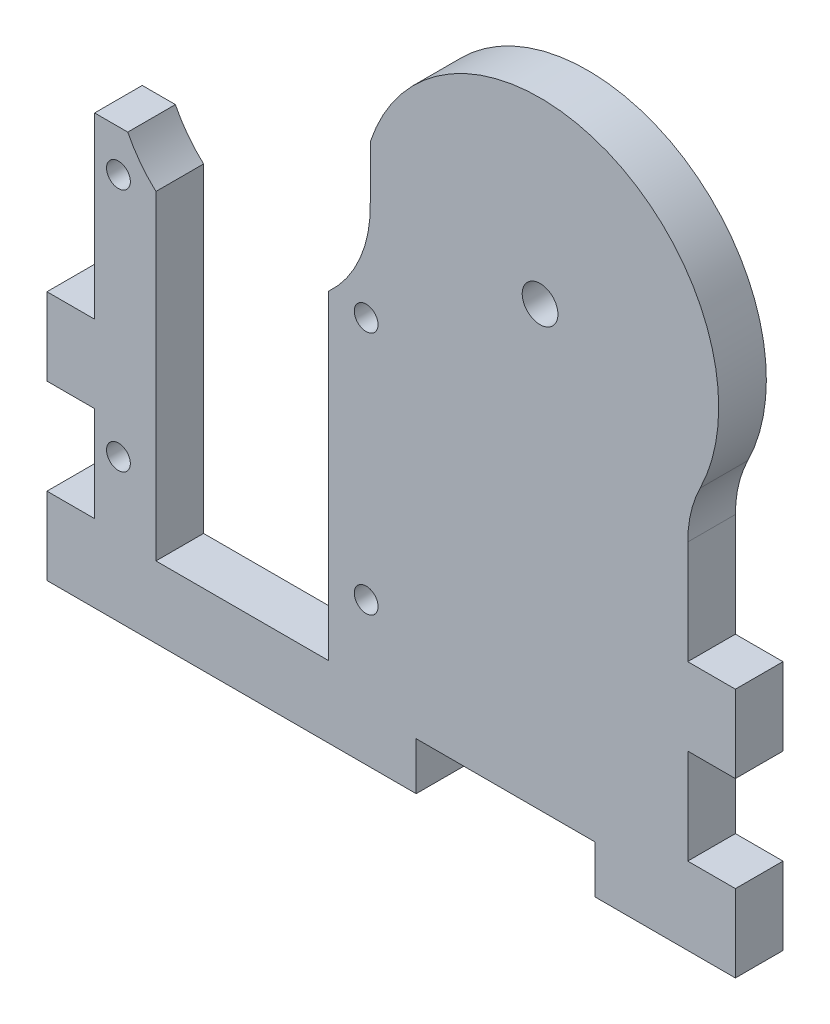
ISO-10303-21;
HEADER;
FILE_DESCRIPTION(('STEP AP214'),'2;1');
FILE_NAME('part.step','',(''),(''),'','','');
FILE_SCHEMA(('AUTOMOTIVE_DESIGN { 1 0 10303 214 1 1 1 1 }'));
ENDSEC;
DATA;
#1=APPLICATION_CONTEXT('core data for automotive mechanical design processes');
#2=APPLICATION_PROTOCOL_DEFINITION('international standard','automotive_design',2000,#1);
#3=PRODUCT_CONTEXT('',#1,'mechanical');
#4=PRODUCT('Part','Part','',(#3));
#5=PRODUCT_RELATED_PRODUCT_CATEGORY('part','',(#4));
#6=PRODUCT_DEFINITION_FORMATION('','',#4);
#7=PRODUCT_DEFINITION_CONTEXT('part definition',#1,'design');
#8=PRODUCT_DEFINITION('design','',#6,#7);
#9=PRODUCT_DEFINITION_SHAPE('','',#8);
#10=(LENGTH_UNIT() NAMED_UNIT(*) SI_UNIT(.MILLI.,.METRE.));
#11=(NAMED_UNIT(*) PLANE_ANGLE_UNIT() SI_UNIT($,.RADIAN.));
#12=(NAMED_UNIT(*) SI_UNIT($,.STERADIAN.) SOLID_ANGLE_UNIT());
#13=UNCERTAINTY_MEASURE_WITH_UNIT(LENGTH_MEASURE(1.E-05),#10,'distance_accuracy_value','');
#14=(GEOMETRIC_REPRESENTATION_CONTEXT(3) GLOBAL_UNCERTAINTY_ASSIGNED_CONTEXT((#13)) GLOBAL_UNIT_ASSIGNED_CONTEXT((#10,
#11,#12)) REPRESENTATION_CONTEXT('',''));
#15=CARTESIAN_POINT('',(0.,0.,0.));
#16=DIRECTION('',(0.,0.,1.));
#17=DIRECTION('',(1.,0.,0.));
#18=AXIS2_PLACEMENT_3D('',#15,#16,#17);
#19=CARTESIAN_POINT('',(49.8,-5.99999999999999,4.));
#20=DIRECTION('',(-1.,0.,0.));
#21=DIRECTION('',(0.,-1.,0.));
#22=AXIS2_PLACEMENT_3D('',#19,#20,#21);
#23=PLANE('',#22);
#24=DIRECTION('',(0.,1.,0.));
#25=VECTOR('',#24,1.);
#26=CARTESIAN_POINT('',(49.8,-5.99999999999999,4.));
#27=LINE('',#26,#25);
#28=CARTESIAN_POINT('',(49.8,15.,4.));
#29=VERTEX_POINT('',#28);
#30=CARTESIAN_POINT('',(49.8,23.7026580113031,4.));
#31=VERTEX_POINT('',#30);
#32=EDGE_CURVE('E376',#29,#31,#27,.T.);
#33=ORIENTED_EDGE('',*,*,#32,.F.);
#34=DIRECTION('',(0.,0.,1.));
#35=VECTOR('',#34,1.);
#36=CARTESIAN_POINT('',(49.8,15.,0.));
#37=LINE('',#36,#35);
#38=CARTESIAN_POINT('',(49.8,15.,0.));
#39=VERTEX_POINT('',#38);
#40=EDGE_CURVE('E267',#39,#29,#37,.T.);
#41=ORIENTED_EDGE('',*,*,#40,.F.);
#42=DIRECTION('',(0.,1.,0.));
#43=VECTOR('',#42,1.);
#44=CARTESIAN_POINT('',(49.8,-5.99999999999999,0.));
#45=LINE('',#44,#43);
#46=CARTESIAN_POINT('',(49.8,23.7026580113031,0.));
#47=VERTEX_POINT('',#46);
#48=EDGE_CURVE('E402',#39,#47,#45,.T.);
#49=ORIENTED_EDGE('',*,*,#48,.T.);
#50=DIRECTION('',(0.,0.,-1.));
#51=VECTOR('',#50,1.);
#52=CARTESIAN_POINT('',(49.8,23.7026580113031,4.));
#53=LINE('',#52,#51);
#54=EDGE_CURVE('E452',#31,#47,#53,.T.);
#55=ORIENTED_EDGE('',*,*,#54,.F.);
#56=EDGE_LOOP('',(#33,#41,#49,#55));
#57=FACE_BOUND('',#56,.T.);
#58=ADVANCED_FACE('F37',(#57),#23,.F.);
#59=CARTESIAN_POINT('',(0.,0.,4.));
#60=DIRECTION('',(1.,0.,0.));
#61=DIRECTION('',(0.,1.,0.));
#62=AXIS2_PLACEMENT_3D('',#59,#60,#61);
#63=PLANE('',#62);
#64=DIRECTION('',(0.,-1.,0.));
#65=VECTOR('',#64,1.);
#66=CARTESIAN_POINT('',(0.,0.,0.));
#67=LINE('',#66,#65);
#68=CARTESIAN_POINT('',(0.,30.,0.));
#69=VERTEX_POINT('',#68);
#70=CARTESIAN_POINT('',(0.,15.,0.));
#71=VERTEX_POINT('',#70);
#72=EDGE_CURVE('E423',#69,#71,#67,.T.);
#73=ORIENTED_EDGE('',*,*,#72,.T.);
#74=DIRECTION('',(0.,0.,1.));
#75=VECTOR('',#74,1.);
#76=CARTESIAN_POINT('',(0.,15.,0.));
#77=LINE('',#76,#75);
#78=CARTESIAN_POINT('',(0.,15.,4.));
#79=VERTEX_POINT('',#78);
#80=EDGE_CURVE('E295',#71,#79,#77,.T.);
#81=ORIENTED_EDGE('',*,*,#80,.T.);
#82=DIRECTION('',(0.,-1.,0.));
#83=VECTOR('',#82,1.);
#84=CARTESIAN_POINT('',(0.,0.,4.));
#85=LINE('',#84,#83);
#86=CARTESIAN_POINT('',(0.,30.,4.));
#87=VERTEX_POINT('',#86);
#88=EDGE_CURVE('E368',#87,#79,#85,.T.);
#89=ORIENTED_EDGE('',*,*,#88,.F.);
#90=DIRECTION('',(0.,0.,-1.));
#91=VECTOR('',#90,1.);
#92=CARTESIAN_POINT('',(0.,30.,4.));
#93=LINE('',#92,#91);
#94=EDGE_CURVE('E398',#87,#69,#93,.T.);
#95=ORIENTED_EDGE('',*,*,#94,.T.);
#96=EDGE_LOOP('',(#73,#81,#89,#95));
#97=FACE_BOUND('',#96,.T.);
#98=ADVANCED_FACE('F493',(#97),#63,.F.);
#99=CARTESIAN_POINT('',(0.,-6.,4.));
#100=DIRECTION('',(0.,1.,0.));
#101=DIRECTION('',(-1.,0.,0.));
#102=AXIS2_PLACEMENT_3D('',#99,#100,#101);
#103=PLANE('',#102);
#104=DIRECTION('',(1.,0.,0.));
#105=VECTOR('',#104,1.);
#106=CARTESIAN_POINT('',(0.,-6.,0.));
#107=LINE('',#106,#105);
#108=CARTESIAN_POINT('',(-4.,-6.,0.));
#109=VERTEX_POINT('',#108);
#110=CARTESIAN_POINT('',(27.,-6.,0.));
#111=VERTEX_POINT('',#110);
#112=EDGE_CURVE('E399',#109,#111,#107,.T.);
#113=ORIENTED_EDGE('',*,*,#112,.T.);
#114=DIRECTION('',(0.,0.,1.));
#115=VECTOR('',#114,1.);
#116=CARTESIAN_POINT('',(27.,-6.,4.));
#117=LINE('',#116,#115);
#118=CARTESIAN_POINT('',(27.,-6.,4.));
#119=VERTEX_POINT('',#118);
#120=EDGE_CURVE('E45',#111,#119,#117,.T.);
#121=ORIENTED_EDGE('',*,*,#120,.T.);
#122=DIRECTION('',(1.,0.,0.));
#123=VECTOR('',#122,1.);
#124=CARTESIAN_POINT('',(0.,-6.,4.));
#125=LINE('',#124,#123);
#126=CARTESIAN_POINT('',(-4.,-6.,4.));
#127=VERTEX_POINT('',#126);
#128=EDGE_CURVE('E373',#127,#119,#125,.T.);
#129=ORIENTED_EDGE('',*,*,#128,.F.);
#130=DIRECTION('',(0.,0.,1.));
#131=VECTOR('',#130,1.);
#132=CARTESIAN_POINT('',(-4.,-6.,0.));
#133=LINE('',#132,#131);
#134=EDGE_CURVE('E314',#109,#127,#133,.T.);
#135=ORIENTED_EDGE('',*,*,#134,.F.);
#136=EDGE_LOOP('',(#113,#121,#129,#135));
#137=FACE_BOUND('',#136,.T.);
#138=ADVANCED_FACE('F459',(#137),#103,.F.);
#139=CARTESIAN_POINT('',(59.8,23.7026580113031,4.));
#140=DIRECTION('',(0.,0.,-1.));
#141=DIRECTION('',(-1.,0.,0.));
#142=AXIS2_PLACEMENT_3D('',#139,#140,#141);
#143=PLANE('',#142);
#144=ORIENTED_EDGE('',*,*,#128,.T.);
#145=DIRECTION('',(0.,-1.,0.));
#146=VECTOR('',#145,1.);
#147=CARTESIAN_POINT('',(27.,-6.,4.));
#148=LINE('',#147,#146);
#149=CARTESIAN_POINT('',(27.,-2.,4.));
#150=VERTEX_POINT('',#149);
#151=EDGE_CURVE('E317',#150,#119,#148,.T.);
#152=ORIENTED_EDGE('',*,*,#151,.F.);
#153=DIRECTION('',(-1.,0.,0.));
#154=VECTOR('',#153,1.);
#155=CARTESIAN_POINT('',(27.,-2.,4.));
#156=LINE('',#155,#154);
#157=CARTESIAN_POINT('',(42.,-2.,4.));
#158=VERTEX_POINT('',#157);
#159=EDGE_CURVE('E326',#158,#150,#156,.T.);
#160=ORIENTED_EDGE('',*,*,#159,.F.);
#161=DIRECTION('',(0.,1.,0.));
#162=VECTOR('',#161,1.);
#163=CARTESIAN_POINT('',(42.,-6.,4.));
#164=LINE('',#163,#162);
#165=CARTESIAN_POINT('',(42.,-6.,4.));
#166=VERTEX_POINT('',#165);
#167=EDGE_CURVE('E323',#166,#158,#164,.T.);
#168=ORIENTED_EDGE('',*,*,#167,.F.);
#169=CARTESIAN_POINT('',(53.8,-6.,4.));
#170=VERTEX_POINT('',#169);
#171=EDGE_CURVE('E371',#166,#170,#125,.T.);
#172=ORIENTED_EDGE('',*,*,#171,.T.);
#173=DIRECTION('',(0.,1.,0.));
#174=VECTOR('',#173,1.);
#175=CARTESIAN_POINT('',(53.8,0.499999999999999,4.));
#176=LINE('',#175,#174);
#177=CARTESIAN_POINT('',(53.8,0.499999999999999,4.));
#178=VERTEX_POINT('',#177);
#179=EDGE_CURVE('E246',#170,#178,#176,.T.);
#180=ORIENTED_EDGE('',*,*,#179,.T.);
#181=DIRECTION('',(-1.,0.,0.));
#182=VECTOR('',#181,1.);
#183=CARTESIAN_POINT('',(49.8,0.499999999999999,4.));
#184=LINE('',#183,#182);
#185=CARTESIAN_POINT('',(49.8,0.499999999999999,4.));
#186=VERTEX_POINT('',#185);
#187=EDGE_CURVE('E52',#178,#186,#184,.T.);
#188=ORIENTED_EDGE('',*,*,#187,.T.);
#189=CARTESIAN_POINT('',(49.8,8.5,4.));
#190=VERTEX_POINT('',#189);
#191=EDGE_CURVE('E377',#186,#190,#27,.T.);
#192=ORIENTED_EDGE('',*,*,#191,.T.);
#193=DIRECTION('',(1.,0.,0.));
#194=VECTOR('',#193,1.);
#195=CARTESIAN_POINT('',(49.8,8.5,4.));
#196=LINE('',#195,#194);
#197=CARTESIAN_POINT('',(53.8,8.5,4.));
#198=VERTEX_POINT('',#197);
#199=EDGE_CURVE('E251',#190,#198,#196,.T.);
#200=ORIENTED_EDGE('',*,*,#199,.T.);
#201=DIRECTION('',(0.,1.,0.));
#202=VECTOR('',#201,1.);
#203=CARTESIAN_POINT('',(53.8,15.,4.));
#204=LINE('',#203,#202);
#205=CARTESIAN_POINT('',(53.8,15.,4.));
#206=VERTEX_POINT('',#205);
#207=EDGE_CURVE('E264',#198,#206,#204,.T.);
#208=ORIENTED_EDGE('',*,*,#207,.T.);
#209=DIRECTION('',(-1.,0.,0.));
#210=VECTOR('',#209,1.);
#211=CARTESIAN_POINT('',(49.8,15.,4.));
#212=LINE('',#211,#210);
#213=EDGE_CURVE('E59',#206,#29,#212,.T.);
#214=ORIENTED_EDGE('',*,*,#213,.T.);
#215=ORIENTED_EDGE('',*,*,#32,.T.);
#216=CARTESIAN_POINT('',(59.8,23.7026580113031,4.));
#217=DIRECTION('',(0.,0.,-1.));
#218=DIRECTION('',(-1.,0.,0.));
#219=AXIS2_PLACEMENT_3D('',#216,#217,#218);
#220=CIRCLE('',#219,10.);
#221=CARTESIAN_POINT('',(50.84,28.143198518944,4.));
#222=VERTEX_POINT('',#221);
#223=EDGE_CURVE('E379',#31,#222,#220,.T.);
#224=ORIENTED_EDGE('',*,*,#223,.T.);
#225=CARTESIAN_POINT('',(37.4,34.8040092804054,4.));
#226=DIRECTION('',(0.,0.,1.));
#227=DIRECTION('',(1.,0.,0.));
#228=AXIS2_PLACEMENT_3D('',#225,#226,#227);
#229=CIRCLE('',#228,15.);
#230=CARTESIAN_POINT('',(23.1454794787238,39.4739819471902,4.));
#231=VERTEX_POINT('',#230);
#232=EDGE_CURVE('E381',#222,#231,#229,.T.);
#233=ORIENTED_EDGE('',*,*,#232,.T.);
#234=DIRECTION('',(0.,-1.,0.));
#235=VECTOR('',#234,1.);
#236=CARTESIAN_POINT('',(23.1454794787238,35.1157315483375,4.));
#237=LINE('',#236,#235);
#238=CARTESIAN_POINT('',(23.1454794787238,35.1157315483375,4.));
#239=VERTEX_POINT('',#238);
#240=EDGE_CURVE('E383',#231,#239,#237,.T.);
#241=ORIENTED_EDGE('',*,*,#240,.T.);
#242=CARTESIAN_POINT('',(12.4,34.8040092804054,4.));
#243=DIRECTION('',(0.,0.,-1.));
#244=DIRECTION('',(1.,0.,0.));
#245=AXIS2_PLACEMENT_3D('',#242,#243,#244);
#246=CIRCLE('',#245,10.75);
#247=CARTESIAN_POINT('',(19.65,26.8667553472116,4.));
#248=VERTEX_POINT('',#247);
#249=EDGE_CURVE('E385',#239,#248,#246,.T.);
#250=ORIENTED_EDGE('',*,*,#249,.T.);
#251=DIRECTION('',(0.,-1.,0.));
#252=VECTOR('',#251,1.);
#253=CARTESIAN_POINT('',(19.65,0.,4.));
#254=LINE('',#253,#252);
#255=CARTESIAN_POINT('',(19.65,0.,4.));
#256=VERTEX_POINT('',#255);
#257=EDGE_CURVE('E387',#248,#256,#254,.T.);
#258=ORIENTED_EDGE('',*,*,#257,.T.);
#259=DIRECTION('',(-1.,0.,0.));
#260=VECTOR('',#259,1.);
#261=CARTESIAN_POINT('',(5.15,0.,4.));
#262=LINE('',#261,#260);
#263=CARTESIAN_POINT('',(5.15,0.,4.));
#264=VERTEX_POINT('',#263);
#265=EDGE_CURVE('E389',#256,#264,#262,.T.);
#266=ORIENTED_EDGE('',*,*,#265,.T.);
#267=DIRECTION('',(0.,1.,0.));
#268=VECTOR('',#267,1.);
#269=CARTESIAN_POINT('',(5.15,0.,4.));
#270=LINE('',#269,#268);
#271=CARTESIAN_POINT('',(5.15,26.8667553472117,4.));
#272=VERTEX_POINT('',#271);
#273=EDGE_CURVE('E391',#264,#272,#270,.T.);
#274=ORIENTED_EDGE('',*,*,#273,.T.);
#275=CARTESIAN_POINT('',(12.4,34.8040092804054,4.));
#276=DIRECTION('',(0.,0.,-1.));
#277=DIRECTION('',(1.,0.,0.));
#278=AXIS2_PLACEMENT_3D('',#275,#276,#277);
#279=CIRCLE('',#278,10.75);
#280=CARTESIAN_POINT('',(2.78314007413134,30.,4.));
#281=VERTEX_POINT('',#280);
#282=EDGE_CURVE('E393',#272,#281,#279,.T.);
#283=ORIENTED_EDGE('',*,*,#282,.T.);
#284=DIRECTION('',(-1.,0.,0.));
#285=VECTOR('',#284,1.);
#286=CARTESIAN_POINT('',(2.78314007413134,30.,4.));
#287=LINE('',#286,#285);
#288=EDGE_CURVE('E395',#281,#87,#287,.T.);
#289=ORIENTED_EDGE('',*,*,#288,.T.);
#290=ORIENTED_EDGE('',*,*,#88,.T.);
#291=DIRECTION('',(-1.,0.,0.));
#292=VECTOR('',#291,1.);
#293=CARTESIAN_POINT('',(0.,15.,4.));
#294=LINE('',#293,#292);
#295=CARTESIAN_POINT('',(-4.,15.,4.));
#296=VERTEX_POINT('',#295);
#297=EDGE_CURVE('E280',#79,#296,#294,.T.);
#298=ORIENTED_EDGE('',*,*,#297,.T.);
#299=DIRECTION('',(0.,-1.,0.));
#300=VECTOR('',#299,1.);
#301=CARTESIAN_POINT('',(-4.,8.5,4.));
#302=LINE('',#301,#300);
#303=CARTESIAN_POINT('',(-4.,8.5,4.));
#304=VERTEX_POINT('',#303);
#305=EDGE_CURVE('E269',#296,#304,#302,.T.);
#306=ORIENTED_EDGE('',*,*,#305,.T.);
#307=DIRECTION('',(1.,0.,0.));
#308=VECTOR('',#307,1.);
#309=CARTESIAN_POINT('',(-4.,8.5,4.));
#310=LINE('',#309,#308);
#311=CARTESIAN_POINT('',(0.,8.5,4.));
#312=VERTEX_POINT('',#311);
#313=EDGE_CURVE('E288',#304,#312,#310,.T.);
#314=ORIENTED_EDGE('',*,*,#313,.T.);
#315=CARTESIAN_POINT('',(0.,0.499999999999999,4.));
#316=VERTEX_POINT('',#315);
#317=EDGE_CURVE('E372',#312,#316,#85,.T.);
#318=ORIENTED_EDGE('',*,*,#317,.T.);
#319=DIRECTION('',(-1.,0.,0.));
#320=VECTOR('',#319,1.);
#321=CARTESIAN_POINT('',(-4.,0.499999999999999,4.));
#322=LINE('',#321,#320);
#323=CARTESIAN_POINT('',(-4.,0.499999999999999,4.));
#324=VERTEX_POINT('',#323);
#325=EDGE_CURVE('E294',#316,#324,#322,.T.);
#326=ORIENTED_EDGE('',*,*,#325,.T.);
#327=DIRECTION('',(0.,-1.,0.));
#328=VECTOR('',#327,1.);
#329=CARTESIAN_POINT('',(-4.,-6.,4.));
#330=LINE('',#329,#328);
#331=EDGE_CURVE('E306',#324,#127,#330,.T.);
#332=ORIENTED_EDGE('',*,*,#331,.T.);
#333=EDGE_LOOP('',(#144,#152,#160,#168,#172,#180,#188,#192,#200,#208,#214,#215,#224,#233,#241,
#250,#258,#266,#274,#283,#289,#290,#298,#306,#314,#318,#326,#332));
#334=FACE_BOUND('',#333,.T.);
#335=CARTESIAN_POINT('',(2.,26.5,4.));
#336=DIRECTION('',(0.,0.,1.));
#337=DIRECTION('',(1.,0.,0.));
#338=AXIS2_PLACEMENT_3D('',#335,#336,#337);
#339=CIRCLE('',#338,1.);
#340=CARTESIAN_POINT('',(3.,26.5,4.));
#341=VERTEX_POINT('',#340);
#342=EDGE_CURVE('E362',#341,#341,#339,.T.);
#343=ORIENTED_EDGE('',*,*,#342,.F.);
#344=EDGE_LOOP('',(#343));
#345=FACE_BOUND('',#344,.T.);
#346=CARTESIAN_POINT('',(22.8,26.5,4.));
#347=DIRECTION('',(0.,0.,1.));
#348=DIRECTION('',(-1.,0.,0.));
#349=AXIS2_PLACEMENT_3D('',#346,#347,#348);
#350=CIRCLE('',#349,1.);
#351=CARTESIAN_POINT('',(21.8,26.5,4.));
#352=VERTEX_POINT('',#351);
#353=EDGE_CURVE('E356',#352,#352,#350,.T.);
#354=ORIENTED_EDGE('',*,*,#353,.F.);
#355=EDGE_LOOP('',(#354));
#356=FACE_BOUND('',#355,.T.);
#357=CARTESIAN_POINT('',(22.8,6.,4.));
#358=DIRECTION('',(0.,0.,1.));
#359=DIRECTION('',(1.,0.,0.));
#360=AXIS2_PLACEMENT_3D('',#357,#358,#359);
#361=CIRCLE('',#360,1.);
#362=CARTESIAN_POINT('',(23.8,6.,4.));
#363=VERTEX_POINT('',#362);
#364=EDGE_CURVE('E350',#363,#363,#361,.T.);
#365=ORIENTED_EDGE('',*,*,#364,.F.);
#366=EDGE_LOOP('',(#365));
#367=FACE_BOUND('',#366,.T.);
#368=CARTESIAN_POINT('',(2.,6.,4.));
#369=DIRECTION('',(0.,0.,1.));
#370=DIRECTION('',(-1.,0.,0.));
#371=AXIS2_PLACEMENT_3D('',#368,#369,#370);
#372=CIRCLE('',#371,1.);
#373=CARTESIAN_POINT('',(1.,6.,4.));
#374=VERTEX_POINT('',#373);
#375=EDGE_CURVE('E344',#374,#374,#372,.T.);
#376=ORIENTED_EDGE('',*,*,#375,.F.);
#377=EDGE_LOOP('',(#376));
#378=FACE_BOUND('',#377,.T.);
#379=CARTESIAN_POINT('',(37.4,34.8040092804054,4.));
#380=DIRECTION('',(0.,0.,1.));
#381=DIRECTION('',(1.,0.,0.));
#382=AXIS2_PLACEMENT_3D('',#379,#380,#381);
#383=CIRCLE('',#382,1.5);
#384=CARTESIAN_POINT('',(38.9,34.8040092804054,4.));
#385=VERTEX_POINT('',#384);
#386=EDGE_CURVE('E338',#385,#385,#383,.T.);
#387=ORIENTED_EDGE('',*,*,#386,.F.);
#388=EDGE_LOOP('',(#387));
#389=FACE_BOUND('',#388,.T.);
#390=ADVANCED_FACE('F463',(#334,#345,#356,#367,#378,#389),#143,.F.);
#391=CARTESIAN_POINT('',(59.8,23.7026580113031,0.));
#392=DIRECTION('',(0.,0.,-1.));
#393=DIRECTION('',(-1.,0.,0.));
#394=AXIS2_PLACEMENT_3D('',#391,#392,#393);
#395=PLANE('',#394);
#396=DIRECTION('',(0.,1.,0.));
#397=VECTOR('',#396,1.);
#398=CARTESIAN_POINT('',(27.,23.7026580113031,0.));
#399=LINE('',#398,#397);
#400=CARTESIAN_POINT('',(27.,-2.,0.));
#401=VERTEX_POINT('',#400);
#402=EDGE_CURVE('E335',#111,#401,#399,.T.);
#403=ORIENTED_EDGE('',*,*,#402,.F.);
#404=ORIENTED_EDGE('',*,*,#112,.F.);
#405=DIRECTION('',(0.,-1.,0.));
#406=VECTOR('',#405,1.);
#407=CARTESIAN_POINT('',(-4.,-6.,0.));
#408=LINE('',#407,#406);
#409=CARTESIAN_POINT('',(-4.,0.499999999999999,0.));
#410=VERTEX_POINT('',#409);
#411=EDGE_CURVE('E305',#410,#109,#408,.T.);
#412=ORIENTED_EDGE('',*,*,#411,.F.);
#413=DIRECTION('',(-1.,0.,0.));
#414=VECTOR('',#413,1.);
#415=CARTESIAN_POINT('',(-4.,0.499999999999999,0.));
#416=LINE('',#415,#414);
#417=CARTESIAN_POINT('',(0.,0.499999999999999,0.));
#418=VERTEX_POINT('',#417);
#419=EDGE_CURVE('E302',#418,#410,#416,.T.);
#420=ORIENTED_EDGE('',*,*,#419,.F.);
#421=CARTESIAN_POINT('',(0.,8.5,0.));
#422=VERTEX_POINT('',#421);
#423=EDGE_CURVE('E422',#422,#418,#67,.T.);
#424=ORIENTED_EDGE('',*,*,#423,.F.);
#425=DIRECTION('',(1.,0.,0.));
#426=VECTOR('',#425,1.);
#427=CARTESIAN_POINT('',(-4.,8.5,0.));
#428=LINE('',#427,#426);
#429=CARTESIAN_POINT('',(-4.,8.5,0.));
#430=VERTEX_POINT('',#429);
#431=EDGE_CURVE('E279',#430,#422,#428,.T.);
#432=ORIENTED_EDGE('',*,*,#431,.F.);
#433=DIRECTION('',(0.,-1.,0.));
#434=VECTOR('',#433,1.);
#435=CARTESIAN_POINT('',(-4.,8.5,0.));
#436=LINE('',#435,#434);
#437=CARTESIAN_POINT('',(-4.,15.,0.));
#438=VERTEX_POINT('',#437);
#439=EDGE_CURVE('E276',#438,#430,#436,.T.);
#440=ORIENTED_EDGE('',*,*,#439,.F.);
#441=DIRECTION('',(-1.,0.,0.));
#442=VECTOR('',#441,1.);
#443=CARTESIAN_POINT('',(0.,15.,0.));
#444=LINE('',#443,#442);
#445=EDGE_CURVE('E282',#71,#438,#444,.T.);
#446=ORIENTED_EDGE('',*,*,#445,.F.);
#447=ORIENTED_EDGE('',*,*,#72,.F.);
#448=DIRECTION('',(-1.,0.,0.));
#449=VECTOR('',#448,1.);
#450=CARTESIAN_POINT('',(2.78314007413134,30.,0.));
#451=LINE('',#450,#449);
#452=CARTESIAN_POINT('',(2.78314007413134,30.,0.));
#453=VERTEX_POINT('',#452);
#454=EDGE_CURVE('E420',#453,#69,#451,.T.);
#455=ORIENTED_EDGE('',*,*,#454,.F.);
#456=CARTESIAN_POINT('',(12.4,34.8040092804054,0.));
#457=DIRECTION('',(0.,0.,-1.));
#458=DIRECTION('',(1.,0.,0.));
#459=AXIS2_PLACEMENT_3D('',#456,#457,#458);
#460=CIRCLE('',#459,10.75);
#461=CARTESIAN_POINT('',(5.15,26.8667553472117,0.));
#462=VERTEX_POINT('',#461);
#463=EDGE_CURVE('E418',#462,#453,#460,.T.);
#464=ORIENTED_EDGE('',*,*,#463,.F.);
#465=DIRECTION('',(0.,1.,0.));
#466=VECTOR('',#465,1.);
#467=CARTESIAN_POINT('',(5.15,0.,0.));
#468=LINE('',#467,#466);
#469=CARTESIAN_POINT('',(5.15,0.,0.));
#470=VERTEX_POINT('',#469);
#471=EDGE_CURVE('E416',#470,#462,#468,.T.);
#472=ORIENTED_EDGE('',*,*,#471,.F.);
#473=DIRECTION('',(-1.,0.,0.));
#474=VECTOR('',#473,1.);
#475=CARTESIAN_POINT('',(5.15,0.,0.));
#476=LINE('',#475,#474);
#477=CARTESIAN_POINT('',(19.65,0.,0.));
#478=VERTEX_POINT('',#477);
#479=EDGE_CURVE('E414',#478,#470,#476,.T.);
#480=ORIENTED_EDGE('',*,*,#479,.F.);
#481=DIRECTION('',(0.,-1.,0.));
#482=VECTOR('',#481,1.);
#483=CARTESIAN_POINT('',(19.65,0.,0.));
#484=LINE('',#483,#482);
#485=CARTESIAN_POINT('',(19.65,26.8667553472116,0.));
#486=VERTEX_POINT('',#485);
#487=EDGE_CURVE('E412',#486,#478,#484,.T.);
#488=ORIENTED_EDGE('',*,*,#487,.F.);
#489=CARTESIAN_POINT('',(12.4,34.8040092804054,0.));
#490=DIRECTION('',(0.,0.,-1.));
#491=DIRECTION('',(1.,0.,0.));
#492=AXIS2_PLACEMENT_3D('',#489,#490,#491);
#493=CIRCLE('',#492,10.75);
#494=CARTESIAN_POINT('',(23.1454794787238,35.1157315483375,0.));
#495=VERTEX_POINT('',#494);
#496=EDGE_CURVE('E410',#495,#486,#493,.T.);
#497=ORIENTED_EDGE('',*,*,#496,.F.);
#498=DIRECTION('',(0.,-1.,0.));
#499=VECTOR('',#498,1.);
#500=CARTESIAN_POINT('',(23.1454794787238,35.1157315483375,0.));
#501=LINE('',#500,#499);
#502=CARTESIAN_POINT('',(23.1454794787238,39.4739819471902,0.));
#503=VERTEX_POINT('',#502);
#504=EDGE_CURVE('E408',#503,#495,#501,.T.);
#505=ORIENTED_EDGE('',*,*,#504,.F.);
#506=CARTESIAN_POINT('',(37.4,34.8040092804054,0.));
#507=DIRECTION('',(0.,0.,1.));
#508=DIRECTION('',(1.,0.,0.));
#509=AXIS2_PLACEMENT_3D('',#506,#507,#508);
#510=CIRCLE('',#509,15.);
#511=CARTESIAN_POINT('',(50.84,28.143198518944,0.));
#512=VERTEX_POINT('',#511);
#513=EDGE_CURVE('E406',#512,#503,#510,.T.);
#514=ORIENTED_EDGE('',*,*,#513,.F.);
#515=CARTESIAN_POINT('',(59.8,23.7026580113031,0.));
#516=DIRECTION('',(0.,0.,-1.));
#517=DIRECTION('',(-1.,0.,0.));
#518=AXIS2_PLACEMENT_3D('',#515,#516,#517);
#519=CIRCLE('',#518,10.);
#520=EDGE_CURVE('E404',#47,#512,#519,.T.);
#521=ORIENTED_EDGE('',*,*,#520,.F.);
#522=ORIENTED_EDGE('',*,*,#48,.F.);
#523=DIRECTION('',(-1.,0.,0.));
#524=VECTOR('',#523,1.);
#525=CARTESIAN_POINT('',(49.8,15.,0.));
#526=LINE('',#525,#524);
#527=CARTESIAN_POINT('',(53.8,15.,0.));
#528=VERTEX_POINT('',#527);
#529=EDGE_CURVE('E259',#528,#39,#526,.T.);
#530=ORIENTED_EDGE('',*,*,#529,.F.);
#531=DIRECTION('',(0.,1.,0.));
#532=VECTOR('',#531,1.);
#533=CARTESIAN_POINT('',(53.8,15.,0.));
#534=LINE('',#533,#532);
#535=CARTESIAN_POINT('',(53.8,8.5,0.));
#536=VERTEX_POINT('',#535);
#537=EDGE_CURVE('E256',#536,#528,#534,.T.);
#538=ORIENTED_EDGE('',*,*,#537,.F.);
#539=DIRECTION('',(1.,0.,0.));
#540=VECTOR('',#539,1.);
#541=CARTESIAN_POINT('',(49.8,8.5,0.));
#542=LINE('',#541,#540);
#543=CARTESIAN_POINT('',(49.8,8.5,0.));
#544=VERTEX_POINT('',#543);
#545=EDGE_CURVE('E253',#544,#536,#542,.T.);
#546=ORIENTED_EDGE('',*,*,#545,.F.);
#547=CARTESIAN_POINT('',(49.8,0.499999999999999,0.));
#548=VERTEX_POINT('',#547);
#549=EDGE_CURVE('E239',#548,#544,#45,.T.);
#550=ORIENTED_EDGE('',*,*,#549,.F.);
#551=DIRECTION('',(-1.,0.,0.));
#552=VECTOR('',#551,1.);
#553=CARTESIAN_POINT('',(49.8,0.499999999999999,0.));
#554=LINE('',#553,#552);
#555=CARTESIAN_POINT('',(53.8,0.499999999999999,0.));
#556=VERTEX_POINT('',#555);
#557=EDGE_CURVE('E223',#556,#548,#554,.T.);
#558=ORIENTED_EDGE('',*,*,#557,.F.);
#559=DIRECTION('',(0.,1.,0.));
#560=VECTOR('',#559,1.);
#561=CARTESIAN_POINT('',(53.8,0.499999999999999,0.));
#562=LINE('',#561,#560);
#563=CARTESIAN_POINT('',(53.8,-6.,0.));
#564=VERTEX_POINT('',#563);
#565=EDGE_CURVE('E237',#564,#556,#562,.T.);
#566=ORIENTED_EDGE('',*,*,#565,.F.);
#567=CARTESIAN_POINT('',(42.,-5.99999999999999,0.));
#568=VERTEX_POINT('',#567);
#569=EDGE_CURVE('E365',#568,#564,#107,.T.);
#570=ORIENTED_EDGE('',*,*,#569,.F.);
#571=DIRECTION('',(0.,-1.,0.));
#572=VECTOR('',#571,1.);
#573=CARTESIAN_POINT('',(42.,23.7026580113031,0.));
#574=LINE('',#573,#572);
#575=CARTESIAN_POINT('',(42.,-2.,0.));
#576=VERTEX_POINT('',#575);
#577=EDGE_CURVE('E332',#576,#568,#574,.T.);
#578=ORIENTED_EDGE('',*,*,#577,.F.);
#579=DIRECTION('',(1.,0.,0.));
#580=VECTOR('',#579,1.);
#581=CARTESIAN_POINT('',(59.8,-2.,0.));
#582=LINE('',#581,#580);
#583=EDGE_CURVE('E11',#401,#576,#582,.T.);
#584=ORIENTED_EDGE('',*,*,#583,.F.);
#585=EDGE_LOOP('',(#403,#404,#412,#420,#424,#432,#440,#446,#447,#455,#464,#472,#480,#488,#497,
#505,#514,#521,#522,#530,#538,#546,#550,#558,#566,#570,#578,#584));
#586=FACE_BOUND('',#585,.T.);
#587=CARTESIAN_POINT('',(2.,6.,0.));
#588=DIRECTION('',(0.,0.,1.));
#589=DIRECTION('',(-1.,0.,0.));
#590=AXIS2_PLACEMENT_3D('',#587,#588,#589);
#591=CIRCLE('',#590,1.);
#592=CARTESIAN_POINT('',(1.,6.,0.));
#593=VERTEX_POINT('',#592);
#594=EDGE_CURVE('E341',#593,#593,#591,.T.);
#595=ORIENTED_EDGE('',*,*,#594,.T.);
#596=EDGE_LOOP('',(#595));
#597=FACE_BOUND('',#596,.T.);
#598=CARTESIAN_POINT('',(22.8,26.5,0.));
#599=DIRECTION('',(0.,0.,1.));
#600=DIRECTION('',(-1.,0.,0.));
#601=AXIS2_PLACEMENT_3D('',#598,#599,#600);
#602=CIRCLE('',#601,1.);
#603=CARTESIAN_POINT('',(21.8,26.5,0.));
#604=VERTEX_POINT('',#603);
#605=EDGE_CURVE('E353',#604,#604,#602,.T.);
#606=ORIENTED_EDGE('',*,*,#605,.T.);
#607=EDGE_LOOP('',(#606));
#608=FACE_BOUND('',#607,.T.);
#609=CARTESIAN_POINT('',(2.,26.5,0.));
#610=DIRECTION('',(0.,0.,1.));
#611=DIRECTION('',(1.,0.,0.));
#612=AXIS2_PLACEMENT_3D('',#609,#610,#611);
#613=CIRCLE('',#612,1.);
#614=CARTESIAN_POINT('',(3.,26.5,0.));
#615=VERTEX_POINT('',#614);
#616=EDGE_CURVE('E359',#615,#615,#613,.T.);
#617=ORIENTED_EDGE('',*,*,#616,.T.);
#618=EDGE_LOOP('',(#617));
#619=FACE_BOUND('',#618,.T.);
#620=CARTESIAN_POINT('',(22.8,6.,0.));
#621=DIRECTION('',(0.,0.,1.));
#622=DIRECTION('',(1.,0.,0.));
#623=AXIS2_PLACEMENT_3D('',#620,#621,#622);
#624=CIRCLE('',#623,1.);
#625=CARTESIAN_POINT('',(23.8,6.,0.));
#626=VERTEX_POINT('',#625);
#627=EDGE_CURVE('E347',#626,#626,#624,.T.);
#628=ORIENTED_EDGE('',*,*,#627,.T.);
#629=EDGE_LOOP('',(#628));
#630=FACE_BOUND('',#629,.T.);
#631=CARTESIAN_POINT('',(37.4,34.8040092804054,0.));
#632=DIRECTION('',(0.,0.,1.));
#633=DIRECTION('',(1.,0.,0.));
#634=AXIS2_PLACEMENT_3D('',#631,#632,#633);
#635=CIRCLE('',#634,1.5);
#636=CARTESIAN_POINT('',(38.9,34.8040092804054,0.));
#637=VERTEX_POINT('',#636);
#638=EDGE_CURVE('E337',#637,#637,#635,.T.);
#639=ORIENTED_EDGE('',*,*,#638,.T.);
#640=EDGE_LOOP('',(#639));
#641=FACE_BOUND('',#640,.T.);
#642=ADVANCED_FACE('F234',(#586,#597,#608,#619,#630,#641),#395,.T.);
#643=ORIENTED_EDGE('',*,*,#171,.F.);
#644=DIRECTION('',(0.,0.,-1.));
#645=VECTOR('',#644,1.);
#646=CARTESIAN_POINT('',(42.,-5.99999999999999,4.));
#647=LINE('',#646,#645);
#648=EDGE_CURVE('E455',#166,#568,#647,.T.);
#649=ORIENTED_EDGE('',*,*,#648,.T.);
#650=ORIENTED_EDGE('',*,*,#569,.T.);
#651=DIRECTION('',(0.,0.,1.));
#652=VECTOR('',#651,1.);
#653=CARTESIAN_POINT('',(53.8,-6.,0.));
#654=LINE('',#653,#652);
#655=EDGE_CURVE('E244',#564,#170,#654,.T.);
#656=ORIENTED_EDGE('',*,*,#655,.T.);
#657=EDGE_LOOP('',(#643,#649,#650,#656));
#658=FACE_BOUND('',#657,.T.);
#659=ADVANCED_FACE('F39',(#658),#103,.F.);
#660=ORIENTED_EDGE('',*,*,#191,.F.);
#661=DIRECTION('',(0.,0.,1.));
#662=VECTOR('',#661,1.);
#663=CARTESIAN_POINT('',(49.8,0.499999999999999,0.));
#664=LINE('',#663,#662);
#665=EDGE_CURVE('E228',#548,#186,#664,.T.);
#666=ORIENTED_EDGE('',*,*,#665,.F.);
#667=ORIENTED_EDGE('',*,*,#549,.T.);
#668=DIRECTION('',(0.,0.,1.));
#669=VECTOR('',#668,1.);
#670=CARTESIAN_POINT('',(49.8,8.5,0.));
#671=LINE('',#670,#669);
#672=EDGE_CURVE('E261',#544,#190,#671,.T.);
#673=ORIENTED_EDGE('',*,*,#672,.T.);
#674=EDGE_LOOP('',(#660,#666,#667,#673));
#675=FACE_BOUND('',#674,.T.);
#676=ADVANCED_FACE('F556',(#675),#23,.F.);
#677=CARTESIAN_POINT('',(59.8,23.7026580113031,4.));
#678=DIRECTION('',(0.,0.,-1.));
#679=DIRECTION('',(-1.,0.,0.));
#680=AXIS2_PLACEMENT_3D('',#677,#678,#679);
#681=CYLINDRICAL_SURFACE('',#680,10.);
#682=ORIENTED_EDGE('',*,*,#520,.T.);
#683=DIRECTION('',(0.,0.,-1.));
#684=VECTOR('',#683,1.);
#685=CARTESIAN_POINT('',(50.84,28.143198518944,4.));
#686=LINE('',#685,#684);
#687=EDGE_CURVE('E449',#222,#512,#686,.T.);
#688=ORIENTED_EDGE('',*,*,#687,.F.);
#689=ORIENTED_EDGE('',*,*,#223,.F.);
#690=ORIENTED_EDGE('',*,*,#54,.T.);
#691=EDGE_LOOP('',(#682,#688,#689,#690));
#692=FACE_BOUND('',#691,.T.);
#693=ADVANCED_FACE('F538',(#692),#681,.F.);
#694=CARTESIAN_POINT('',(37.4,34.8040092804054,4.));
#695=DIRECTION('',(0.,0.,-1.));
#696=DIRECTION('',(-1.,0.,0.));
#697=AXIS2_PLACEMENT_3D('',#694,#695,#696);
#698=CYLINDRICAL_SURFACE('',#697,15.);
#699=ORIENTED_EDGE('',*,*,#513,.T.);
#700=DIRECTION('',(0.,0.,-1.));
#701=VECTOR('',#700,1.);
#702=CARTESIAN_POINT('',(23.1454794787238,39.4739819471902,4.));
#703=LINE('',#702,#701);
#704=EDGE_CURVE('E446',#231,#503,#703,.T.);
#705=ORIENTED_EDGE('',*,*,#704,.F.);
#706=ORIENTED_EDGE('',*,*,#232,.F.);
#707=ORIENTED_EDGE('',*,*,#687,.T.);
#708=EDGE_LOOP('',(#699,#705,#706,#707));
#709=FACE_BOUND('',#708,.T.);
#710=ADVANCED_FACE('F533',(#709),#698,.T.);
#711=CARTESIAN_POINT('',(23.1454794787238,35.1157315483375,4.));
#712=DIRECTION('',(1.,0.,0.));
#713=DIRECTION('',(0.,1.,0.));
#714=AXIS2_PLACEMENT_3D('',#711,#712,#713);
#715=PLANE('',#714);
#716=ORIENTED_EDGE('',*,*,#504,.T.);
#717=DIRECTION('',(0.,0.,-1.));
#718=VECTOR('',#717,1.);
#719=CARTESIAN_POINT('',(23.1454794787238,35.1157315483375,4.));
#720=LINE('',#719,#718);
#721=EDGE_CURVE('E443',#239,#495,#720,.T.);
#722=ORIENTED_EDGE('',*,*,#721,.F.);
#723=ORIENTED_EDGE('',*,*,#240,.F.);
#724=ORIENTED_EDGE('',*,*,#704,.T.);
#725=EDGE_LOOP('',(#716,#722,#723,#724));
#726=FACE_BOUND('',#725,.T.);
#727=ADVANCED_FACE('F527',(#726),#715,.F.);
#728=CARTESIAN_POINT('',(12.4,34.8040092804054,4.));
#729=DIRECTION('',(0.,0.,-1.));
#730=DIRECTION('',(-1.,0.,0.));
#731=AXIS2_PLACEMENT_3D('',#728,#729,#730);
#732=CYLINDRICAL_SURFACE('',#731,10.75);
#733=ORIENTED_EDGE('',*,*,#496,.T.);
#734=DIRECTION('',(0.,0.,-1.));
#735=VECTOR('',#734,1.);
#736=CARTESIAN_POINT('',(19.65,26.8667553472116,4.));
#737=LINE('',#736,#735);
#738=EDGE_CURVE('E440',#248,#486,#737,.T.);
#739=ORIENTED_EDGE('',*,*,#738,.F.);
#740=ORIENTED_EDGE('',*,*,#249,.F.);
#741=ORIENTED_EDGE('',*,*,#721,.T.);
#742=EDGE_LOOP('',(#733,#739,#740,#741));
#743=FACE_BOUND('',#742,.T.);
#744=ADVANCED_FACE('F523',(#743),#732,.F.);
#745=CARTESIAN_POINT('',(19.65,0.,4.));
#746=DIRECTION('',(1.,0.,0.));
#747=DIRECTION('',(0.,0.,-1.));
#748=AXIS2_PLACEMENT_3D('',#745,#746,#747);
#749=PLANE('',#748);
#750=ORIENTED_EDGE('',*,*,#487,.T.);
#751=DIRECTION('',(0.,0.,-1.));
#752=VECTOR('',#751,1.);
#753=CARTESIAN_POINT('',(19.65,0.,4.));
#754=LINE('',#753,#752);
#755=EDGE_CURVE('E437',#256,#478,#754,.T.);
#756=ORIENTED_EDGE('',*,*,#755,.F.);
#757=ORIENTED_EDGE('',*,*,#257,.F.);
#758=ORIENTED_EDGE('',*,*,#738,.T.);
#759=EDGE_LOOP('',(#750,#756,#757,#758));
#760=FACE_BOUND('',#759,.T.);
#761=ADVANCED_FACE('F518',(#760),#749,.F.);
#762=CARTESIAN_POINT('',(5.15,0.,4.));
#763=DIRECTION('',(0.,-1.,0.));
#764=DIRECTION('',(0.,0.,-1.));
#765=AXIS2_PLACEMENT_3D('',#762,#763,#764);
#766=PLANE('',#765);
#767=ORIENTED_EDGE('',*,*,#479,.T.);
#768=DIRECTION('',(0.,0.,-1.));
#769=VECTOR('',#768,1.);
#770=CARTESIAN_POINT('',(5.15,0.,4.));
#771=LINE('',#770,#769);
#772=EDGE_CURVE('E434',#264,#470,#771,.T.);
#773=ORIENTED_EDGE('',*,*,#772,.F.);
#774=ORIENTED_EDGE('',*,*,#265,.F.);
#775=ORIENTED_EDGE('',*,*,#755,.T.);
#776=EDGE_LOOP('',(#767,#773,#774,#775));
#777=FACE_BOUND('',#776,.T.);
#778=ADVANCED_FACE('F512',(#777),#766,.F.);
#779=CARTESIAN_POINT('',(5.15,0.,4.));
#780=DIRECTION('',(-1.,0.,0.));
#781=DIRECTION('',(0.,0.,1.));
#782=AXIS2_PLACEMENT_3D('',#779,#780,#781);
#783=PLANE('',#782);
#784=ORIENTED_EDGE('',*,*,#471,.T.);
#785=DIRECTION('',(0.,0.,-1.));
#786=VECTOR('',#785,1.);
#787=CARTESIAN_POINT('',(5.15,26.8667553472117,4.));
#788=LINE('',#787,#786);
#789=EDGE_CURVE('E431',#272,#462,#788,.T.);
#790=ORIENTED_EDGE('',*,*,#789,.F.);
#791=ORIENTED_EDGE('',*,*,#273,.F.);
#792=ORIENTED_EDGE('',*,*,#772,.T.);
#793=EDGE_LOOP('',(#784,#790,#791,#792));
#794=FACE_BOUND('',#793,.T.);
#795=ADVANCED_FACE('F508',(#794),#783,.F.);
#796=CARTESIAN_POINT('',(12.4,34.8040092804054,4.));
#797=DIRECTION('',(0.,0.,-1.));
#798=DIRECTION('',(-1.,0.,0.));
#799=AXIS2_PLACEMENT_3D('',#796,#797,#798);
#800=CYLINDRICAL_SURFACE('',#799,10.75);
#801=ORIENTED_EDGE('',*,*,#463,.T.);
#802=DIRECTION('',(0.,0.,-1.));
#803=VECTOR('',#802,1.);
#804=CARTESIAN_POINT('',(2.78314007413134,30.,4.));
#805=LINE('',#804,#803);
#806=EDGE_CURVE('E428',#281,#453,#805,.T.);
#807=ORIENTED_EDGE('',*,*,#806,.F.);
#808=ORIENTED_EDGE('',*,*,#282,.F.);
#809=ORIENTED_EDGE('',*,*,#789,.T.);
#810=EDGE_LOOP('',(#801,#807,#808,#809));
#811=FACE_BOUND('',#810,.T.);
#812=ADVANCED_FACE('F503',(#811),#800,.F.);
#813=CARTESIAN_POINT('',(2.78314007413134,30.,4.));
#814=DIRECTION('',(0.,-1.,0.));
#815=DIRECTION('',(1.,0.,0.));
#816=AXIS2_PLACEMENT_3D('',#813,#814,#815);
#817=PLANE('',#816);
#818=ORIENTED_EDGE('',*,*,#454,.T.);
#819=ORIENTED_EDGE('',*,*,#94,.F.);
#820=ORIENTED_EDGE('',*,*,#288,.F.);
#821=ORIENTED_EDGE('',*,*,#806,.T.);
#822=EDGE_LOOP('',(#818,#819,#820,#821));
#823=FACE_BOUND('',#822,.T.);
#824=ADVANCED_FACE('F497',(#823),#817,.F.);
#825=ORIENTED_EDGE('',*,*,#317,.F.);
#826=DIRECTION('',(0.,0.,1.));
#827=VECTOR('',#826,1.);
#828=CARTESIAN_POINT('',(0.,8.5,0.));
#829=LINE('',#828,#827);
#830=EDGE_CURVE('E298',#422,#312,#829,.T.);
#831=ORIENTED_EDGE('',*,*,#830,.F.);
#832=ORIENTED_EDGE('',*,*,#423,.T.);
#833=DIRECTION('',(0.,0.,1.));
#834=VECTOR('',#833,1.);
#835=CARTESIAN_POINT('',(0.,0.499999999999999,0.));
#836=LINE('',#835,#834);
#837=EDGE_CURVE('E309',#418,#316,#836,.T.);
#838=ORIENTED_EDGE('',*,*,#837,.T.);
#839=EDGE_LOOP('',(#825,#831,#832,#838));
#840=FACE_BOUND('',#839,.T.);
#841=ADVANCED_FACE('F478',(#840),#63,.F.);
#842=CARTESIAN_POINT('',(2.,26.5,4.));
#843=DIRECTION('',(0.,0.,-1.));
#844=DIRECTION('',(-1.,0.,0.));
#845=AXIS2_PLACEMENT_3D('',#842,#843,#844);
#846=CYLINDRICAL_SURFACE('',#845,1.);
#847=ORIENTED_EDGE('',*,*,#342,.T.);
#848=EDGE_LOOP('',(#847));
#849=FACE_BOUND('',#848,.T.);
#850=ORIENTED_EDGE('',*,*,#616,.F.);
#851=EDGE_LOOP('',(#850));
#852=FACE_BOUND('',#851,.T.);
#853=ADVANCED_FACE('F575',(#849,#852),#846,.F.);
#854=CARTESIAN_POINT('',(22.8,26.5,4.));
#855=DIRECTION('',(0.,0.,-1.));
#856=DIRECTION('',(-1.,0.,0.));
#857=AXIS2_PLACEMENT_3D('',#854,#855,#856);
#858=CYLINDRICAL_SURFACE('',#857,1.);
#859=ORIENTED_EDGE('',*,*,#353,.T.);
#860=EDGE_LOOP('',(#859));
#861=FACE_BOUND('',#860,.T.);
#862=ORIENTED_EDGE('',*,*,#605,.F.);
#863=EDGE_LOOP('',(#862));
#864=FACE_BOUND('',#863,.T.);
#865=ADVANCED_FACE('F580',(#861,#864),#858,.F.);
#866=CARTESIAN_POINT('',(22.8,6.,4.));
#867=DIRECTION('',(0.,0.,-1.));
#868=DIRECTION('',(-1.,0.,0.));
#869=AXIS2_PLACEMENT_3D('',#866,#867,#868);
#870=CYLINDRICAL_SURFACE('',#869,1.);
#871=ORIENTED_EDGE('',*,*,#364,.T.);
#872=EDGE_LOOP('',(#871));
#873=FACE_BOUND('',#872,.T.);
#874=ORIENTED_EDGE('',*,*,#627,.F.);
#875=EDGE_LOOP('',(#874));
#876=FACE_BOUND('',#875,.T.);
#877=ADVANCED_FACE('F648',(#873,#876),#870,.F.);
#878=CARTESIAN_POINT('',(2.,6.,4.));
#879=DIRECTION('',(0.,0.,-1.));
#880=DIRECTION('',(-1.,0.,0.));
#881=AXIS2_PLACEMENT_3D('',#878,#879,#880);
#882=CYLINDRICAL_SURFACE('',#881,1.);
#883=ORIENTED_EDGE('',*,*,#375,.T.);
#884=EDGE_LOOP('',(#883));
#885=FACE_BOUND('',#884,.T.);
#886=ORIENTED_EDGE('',*,*,#594,.F.);
#887=EDGE_LOOP('',(#886));
#888=FACE_BOUND('',#887,.T.);
#889=ADVANCED_FACE('F658',(#885,#888),#882,.F.);
#890=CARTESIAN_POINT('',(37.4,34.8040092804054,4.));
#891=DIRECTION('',(0.,0.,-1.));
#892=DIRECTION('',(-1.,0.,0.));
#893=AXIS2_PLACEMENT_3D('',#890,#891,#892);
#894=CYLINDRICAL_SURFACE('',#893,1.5);
#895=ORIENTED_EDGE('',*,*,#386,.T.);
#896=EDGE_LOOP('',(#895));
#897=FACE_BOUND('',#896,.T.);
#898=ORIENTED_EDGE('',*,*,#638,.F.);
#899=EDGE_LOOP('',(#898));
#900=FACE_BOUND('',#899,.T.);
#901=ADVANCED_FACE('F668',(#897,#900),#894,.F.);
#902=CARTESIAN_POINT('',(27.,-6.,-6.));
#903=DIRECTION('',(-1.,0.,0.));
#904=DIRECTION('',(0.,0.,1.));
#905=AXIS2_PLACEMENT_3D('',#902,#903,#904);
#906=PLANE('',#905);
#907=ORIENTED_EDGE('',*,*,#402,.T.);
#908=DIRECTION('',(0.,0.,1.));
#909=VECTOR('',#908,1.);
#910=CARTESIAN_POINT('',(27.,-2.,-6.));
#911=LINE('',#910,#909);
#912=EDGE_CURVE('E330',#401,#150,#911,.T.);
#913=ORIENTED_EDGE('',*,*,#912,.T.);
#914=ORIENTED_EDGE('',*,*,#151,.T.);
#915=ORIENTED_EDGE('',*,*,#120,.F.);
#916=EDGE_LOOP('',(#907,#913,#914,#915));
#917=FACE_BOUND('',#916,.T.);
#918=ADVANCED_FACE('F678',(#917),#906,.F.);
#919=CARTESIAN_POINT('',(27.,-2.,-6.));
#920=DIRECTION('',(0.,1.,0.));
#921=DIRECTION('',(0.,0.,1.));
#922=AXIS2_PLACEMENT_3D('',#919,#920,#921);
#923=PLANE('',#922);
#924=ORIENTED_EDGE('',*,*,#583,.T.);
#925=DIRECTION('',(0.,0.,1.));
#926=VECTOR('',#925,1.);
#927=CARTESIAN_POINT('',(42.,-2.,-6.));
#928=LINE('',#927,#926);
#929=EDGE_CURVE('E329',#576,#158,#928,.T.);
#930=ORIENTED_EDGE('',*,*,#929,.T.);
#931=ORIENTED_EDGE('',*,*,#159,.T.);
#932=ORIENTED_EDGE('',*,*,#912,.F.);
#933=EDGE_LOOP('',(#924,#930,#931,#932));
#934=FACE_BOUND('',#933,.T.);
#935=ADVANCED_FACE('F689',(#934),#923,.F.);
#936=CARTESIAN_POINT('',(42.,-6.,-6.));
#937=DIRECTION('',(1.,0.,0.));
#938=DIRECTION('',(0.,0.,-1.));
#939=AXIS2_PLACEMENT_3D('',#936,#937,#938);
#940=PLANE('',#939);
#941=ORIENTED_EDGE('',*,*,#577,.T.);
#942=ORIENTED_EDGE('',*,*,#648,.F.);
#943=ORIENTED_EDGE('',*,*,#167,.T.);
#944=ORIENTED_EDGE('',*,*,#929,.F.);
#945=EDGE_LOOP('',(#941,#942,#943,#944));
#946=FACE_BOUND('',#945,.T.);
#947=ADVANCED_FACE('F698',(#946),#940,.F.);
#948=CARTESIAN_POINT('',(-4.,-6.,0.));
#949=DIRECTION('',(-1.,0.,0.));
#950=DIRECTION('',(0.,0.,1.));
#951=AXIS2_PLACEMENT_3D('',#948,#949,#950);
#952=PLANE('',#951);
#953=ORIENTED_EDGE('',*,*,#331,.F.);
#954=DIRECTION('',(0.,0.,1.));
#955=VECTOR('',#954,1.);
#956=CARTESIAN_POINT('',(-4.,0.499999999999999,0.));
#957=LINE('',#956,#955);
#958=EDGE_CURVE('E318',#410,#324,#957,.T.);
#959=ORIENTED_EDGE('',*,*,#958,.F.);
#960=ORIENTED_EDGE('',*,*,#411,.T.);
#961=ORIENTED_EDGE('',*,*,#134,.T.);
#962=EDGE_LOOP('',(#953,#959,#960,#961));
#963=FACE_BOUND('',#962,.T.);
#964=ADVANCED_FACE('F469',(#963),#952,.T.);
#965=CARTESIAN_POINT('',(-4.,0.499999999999999,0.));
#966=DIRECTION('',(0.,1.,0.));
#967=DIRECTION('',(0.,0.,1.));
#968=AXIS2_PLACEMENT_3D('',#965,#966,#967);
#969=PLANE('',#968);
#970=ORIENTED_EDGE('',*,*,#325,.F.);
#971=ORIENTED_EDGE('',*,*,#837,.F.);
#972=ORIENTED_EDGE('',*,*,#419,.T.);
#973=ORIENTED_EDGE('',*,*,#958,.T.);
#974=EDGE_LOOP('',(#970,#971,#972,#973));
#975=FACE_BOUND('',#974,.T.);
#976=ADVANCED_FACE('F475',(#975),#969,.T.);
#977=CARTESIAN_POINT('',(-4.,8.5,0.));
#978=DIRECTION('',(-1.,0.,0.));
#979=DIRECTION('',(0.,0.,1.));
#980=AXIS2_PLACEMENT_3D('',#977,#978,#979);
#981=PLANE('',#980);
#982=ORIENTED_EDGE('',*,*,#305,.F.);
#983=DIRECTION('',(0.,0.,1.));
#984=VECTOR('',#983,1.);
#985=CARTESIAN_POINT('',(-4.,15.,0.));
#986=LINE('',#985,#984);
#987=EDGE_CURVE('E292',#438,#296,#986,.T.);
#988=ORIENTED_EDGE('',*,*,#987,.F.);
#989=ORIENTED_EDGE('',*,*,#439,.T.);
#990=DIRECTION('',(0.,0.,1.));
#991=VECTOR('',#990,1.);
#992=CARTESIAN_POINT('',(-4.,8.5,0.));
#993=LINE('',#992,#991);
#994=EDGE_CURVE('E285',#430,#304,#993,.T.);
#995=ORIENTED_EDGE('',*,*,#994,.T.);
#996=EDGE_LOOP('',(#982,#988,#989,#995));
#997=FACE_BOUND('',#996,.T.);
#998=ADVANCED_FACE('F486',(#997),#981,.T.);
#999=CARTESIAN_POINT('',(0.,15.,0.));
#1000=DIRECTION('',(0.,1.,0.));
#1001=DIRECTION('',(0.,0.,1.));
#1002=AXIS2_PLACEMENT_3D('',#999,#1000,#1001);
#1003=PLANE('',#1002);
#1004=ORIENTED_EDGE('',*,*,#297,.F.);
#1005=ORIENTED_EDGE('',*,*,#80,.F.);
#1006=ORIENTED_EDGE('',*,*,#445,.T.);
#1007=ORIENTED_EDGE('',*,*,#987,.T.);
#1008=EDGE_LOOP('',(#1004,#1005,#1006,#1007));
#1009=FACE_BOUND('',#1008,.T.);
#1010=ADVANCED_FACE('F489',(#1009),#1003,.T.);
#1011=CARTESIAN_POINT('',(-4.,8.5,0.));
#1012=DIRECTION('',(0.,-1.,0.));
#1013=DIRECTION('',(0.,0.,-1.));
#1014=AXIS2_PLACEMENT_3D('',#1011,#1012,#1013);
#1015=PLANE('',#1014);
#1016=ORIENTED_EDGE('',*,*,#313,.F.);
#1017=ORIENTED_EDGE('',*,*,#994,.F.);
#1018=ORIENTED_EDGE('',*,*,#431,.T.);
#1019=ORIENTED_EDGE('',*,*,#830,.T.);
#1020=EDGE_LOOP('',(#1016,#1017,#1018,#1019));
#1021=FACE_BOUND('',#1020,.T.);
#1022=ADVANCED_FACE('F790',(#1021),#1015,.T.);
#1023=CARTESIAN_POINT('',(49.8,15.,0.));
#1024=DIRECTION('',(0.,1.,0.));
#1025=DIRECTION('',(0.,0.,1.));
#1026=AXIS2_PLACEMENT_3D('',#1023,#1024,#1025);
#1027=PLANE('',#1026);
#1028=ORIENTED_EDGE('',*,*,#213,.F.);
#1029=DIRECTION('',(0.,0.,1.));
#1030=VECTOR('',#1029,1.);
#1031=CARTESIAN_POINT('',(53.8,15.,0.));
#1032=LINE('',#1031,#1030);
#1033=EDGE_CURVE('E270',#528,#206,#1032,.T.);
#1034=ORIENTED_EDGE('',*,*,#1033,.F.);
#1035=ORIENTED_EDGE('',*,*,#529,.T.);
#1036=ORIENTED_EDGE('',*,*,#40,.T.);
#1037=EDGE_LOOP('',(#1028,#1034,#1035,#1036));
#1038=FACE_BOUND('',#1037,.T.);
#1039=ADVANCED_FACE('F546',(#1038),#1027,.T.);
#1040=CARTESIAN_POINT('',(53.8,15.,0.));
#1041=DIRECTION('',(1.,0.,0.));
#1042=DIRECTION('',(0.,1.,0.));
#1043=AXIS2_PLACEMENT_3D('',#1040,#1041,#1042);
#1044=PLANE('',#1043);
#1045=ORIENTED_EDGE('',*,*,#207,.F.);
#1046=DIRECTION('',(0.,0.,1.));
#1047=VECTOR('',#1046,1.);
#1048=CARTESIAN_POINT('',(53.8,8.5,0.));
#1049=LINE('',#1048,#1047);
#1050=EDGE_CURVE('E272',#536,#198,#1049,.T.);
#1051=ORIENTED_EDGE('',*,*,#1050,.F.);
#1052=ORIENTED_EDGE('',*,*,#537,.T.);
#1053=ORIENTED_EDGE('',*,*,#1033,.T.);
#1054=EDGE_LOOP('',(#1045,#1051,#1052,#1053));
#1055=FACE_BOUND('',#1054,.T.);
#1056=ADVANCED_FACE('F549',(#1055),#1044,.T.);
#1057=CARTESIAN_POINT('',(49.8,8.5,0.));
#1058=DIRECTION('',(0.,-1.,0.));
#1059=DIRECTION('',(0.,0.,-1.));
#1060=AXIS2_PLACEMENT_3D('',#1057,#1058,#1059);
#1061=PLANE('',#1060);
#1062=ORIENTED_EDGE('',*,*,#199,.F.);
#1063=ORIENTED_EDGE('',*,*,#672,.F.);
#1064=ORIENTED_EDGE('',*,*,#545,.T.);
#1065=ORIENTED_EDGE('',*,*,#1050,.T.);
#1066=EDGE_LOOP('',(#1062,#1063,#1064,#1065));
#1067=FACE_BOUND('',#1066,.T.);
#1068=ADVANCED_FACE('F552',(#1067),#1061,.T.);
#1069=CARTESIAN_POINT('',(53.8,0.499999999999999,0.));
#1070=DIRECTION('',(1.,0.,0.));
#1071=DIRECTION('',(0.,1.,0.));
#1072=AXIS2_PLACEMENT_3D('',#1069,#1070,#1071);
#1073=PLANE('',#1072);
#1074=ORIENTED_EDGE('',*,*,#179,.F.);
#1075=ORIENTED_EDGE('',*,*,#655,.F.);
#1076=ORIENTED_EDGE('',*,*,#565,.T.);
#1077=DIRECTION('',(0.,0.,1.));
#1078=VECTOR('',#1077,1.);
#1079=CARTESIAN_POINT('',(53.8,0.499999999999999,0.));
#1080=LINE('',#1079,#1078);
#1081=EDGE_CURVE('E220',#556,#178,#1080,.T.);
#1082=ORIENTED_EDGE('',*,*,#1081,.T.);
#1083=EDGE_LOOP('',(#1074,#1075,#1076,#1082));
#1084=FACE_BOUND('',#1083,.T.);
#1085=ADVANCED_FACE('F242',(#1084),#1073,.T.);
#1086=CARTESIAN_POINT('',(49.8,0.499999999999999,0.));
#1087=DIRECTION('',(0.,1.,0.));
#1088=DIRECTION('',(0.,0.,1.));
#1089=AXIS2_PLACEMENT_3D('',#1086,#1087,#1088);
#1090=PLANE('',#1089);
#1091=ORIENTED_EDGE('',*,*,#187,.F.);
#1092=ORIENTED_EDGE('',*,*,#1081,.F.);
#1093=ORIENTED_EDGE('',*,*,#557,.T.);
#1094=ORIENTED_EDGE('',*,*,#665,.T.);
#1095=EDGE_LOOP('',(#1091,#1092,#1093,#1094));
#1096=FACE_BOUND('',#1095,.T.);
#1097=ADVANCED_FACE('F222',(#1096),#1090,.T.);
#1098=CLOSED_SHELL('',(#58,#98,#138,#390,#642,#659,#676,#693,#710,#727,#744,#761,#778,#795,#812,
#824,#841,#853,#865,#877,#889,#901,#918,#935,#947,#964,#976,#998,#1010,#1022,#1039,#1056,#1068,
#1085,#1097));
#1099=MANIFOLD_SOLID_BREP('B2',#1098);
#1100=ADVANCED_BREP_SHAPE_REPRESENTATION('',(#18,#1099),#14);
#1101=SHAPE_DEFINITION_REPRESENTATION(#9,#1100);
ENDSEC;
END-ISO-10303-21;
